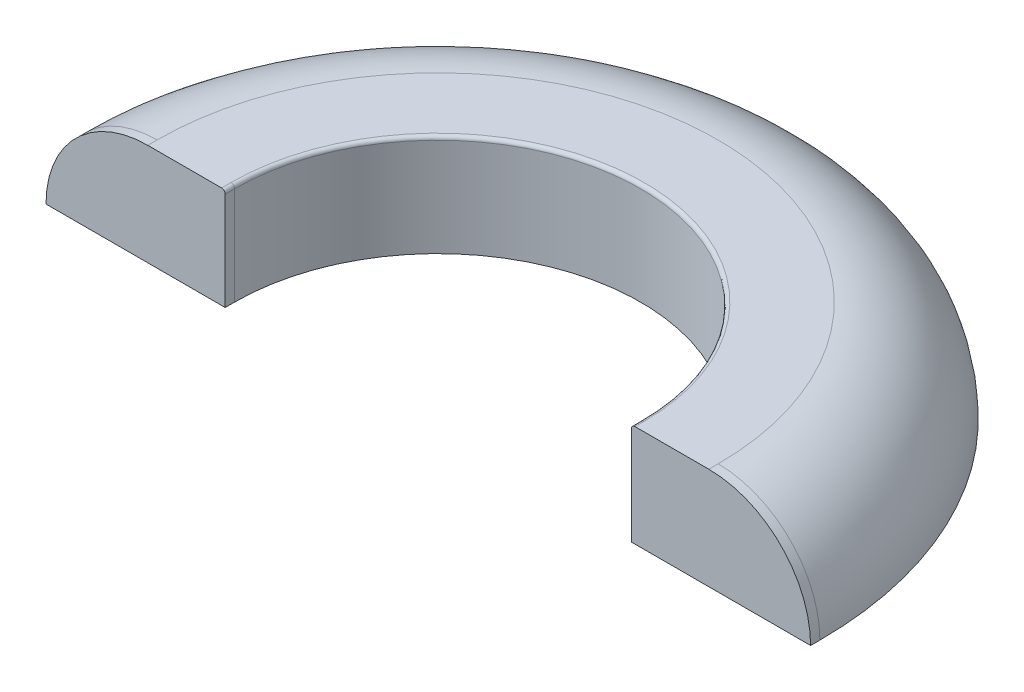
ISO-10303-21;
HEADER;
FILE_DESCRIPTION(('STEP AP214'),'2;1');
FILE_NAME('part.step','',(''),(''),'','','');
FILE_SCHEMA(('AUTOMOTIVE_DESIGN { 1 0 10303 214 1 1 1 1 }'));
ENDSEC;
DATA;
#1=APPLICATION_CONTEXT('core data for automotive mechanical design processes');
#2=APPLICATION_PROTOCOL_DEFINITION('international standard','automotive_design',2000,#1);
#3=PRODUCT_CONTEXT('',#1,'mechanical');
#4=PRODUCT('Part','Part','',(#3));
#5=PRODUCT_RELATED_PRODUCT_CATEGORY('part','',(#4));
#6=PRODUCT_DEFINITION_FORMATION('','',#4);
#7=PRODUCT_DEFINITION_CONTEXT('part definition',#1,'design');
#8=PRODUCT_DEFINITION('design','',#6,#7);
#9=PRODUCT_DEFINITION_SHAPE('','',#8);
#10=(LENGTH_UNIT() NAMED_UNIT(*) SI_UNIT(.MILLI.,.METRE.));
#11=(NAMED_UNIT(*) PLANE_ANGLE_UNIT() SI_UNIT($,.RADIAN.));
#12=(NAMED_UNIT(*) SI_UNIT($,.STERADIAN.) SOLID_ANGLE_UNIT());
#13=UNCERTAINTY_MEASURE_WITH_UNIT(LENGTH_MEASURE(1.E-05),#10,'distance_accuracy_value','');
#14=(GEOMETRIC_REPRESENTATION_CONTEXT(3) GLOBAL_UNCERTAINTY_ASSIGNED_CONTEXT((#13)) GLOBAL_UNIT_ASSIGNED_CONTEXT((#10,
#11,#12)) REPRESENTATION_CONTEXT('',''));
#15=CARTESIAN_POINT('',(0.,0.,0.));
#16=DIRECTION('',(0.,0.,1.));
#17=DIRECTION('',(1.,0.,0.));
#18=AXIS2_PLACEMENT_3D('',#15,#16,#17);
#19=CARTESIAN_POINT('',(0.,500.,0.));
#20=DIRECTION('',(0.,-1.,0.));
#21=DIRECTION('',(0.,0.,-1.));
#22=AXIS2_PLACEMENT_3D('',#19,#20,#21);
#23=CYLINDRICAL_SURFACE('',#22,566.6);
#24=CARTESIAN_POINT('',(0.,216.,0.));
#25=DIRECTION('',(0.,-1.,0.));
#26=DIRECTION('',(0.,0.,-1.));
#27=AXIS2_PLACEMENT_3D('',#24,#25,#26);
#28=CIRCLE('',#27,566.6);
#29=CARTESIAN_POINT('',(-566.6,216.,0.));
#30=VERTEX_POINT('',#29);
#31=CARTESIAN_POINT('',(566.6,216.,0.));
#32=VERTEX_POINT('',#31);
#33=EDGE_CURVE('E187',#30,#32,#28,.T.);
#34=ORIENTED_EDGE('',*,*,#33,.T.);
#35=DIRECTION('',(0.,-1.,0.));
#36=VECTOR('',#35,1.);
#37=CARTESIAN_POINT('',(566.6,500.,0.));
#38=LINE('',#37,#36);
#39=CARTESIAN_POINT('',(566.6,490.,0.));
#40=VERTEX_POINT('',#39);
#41=EDGE_CURVE('E205',#40,#32,#38,.T.);
#42=ORIENTED_EDGE('',*,*,#41,.F.);
#43=CARTESIAN_POINT('',(0.,490.,0.));
#44=DIRECTION('',(0.,-1.,0.));
#45=DIRECTION('',(0.,0.,-1.));
#46=AXIS2_PLACEMENT_3D('',#43,#44,#45);
#47=CIRCLE('',#46,566.6);
#48=CARTESIAN_POINT('',(-566.6,490.,0.));
#49=VERTEX_POINT('',#48);
#50=EDGE_CURVE('E11',#40,#49,#47,.F.);
#51=ORIENTED_EDGE('',*,*,#50,.T.);
#52=DIRECTION('',(0.,-1.,0.));
#53=VECTOR('',#52,1.);
#54=CARTESIAN_POINT('',(-566.6,500.,0.));
#55=LINE('',#54,#53);
#56=EDGE_CURVE('E201',#49,#30,#55,.T.);
#57=ORIENTED_EDGE('',*,*,#56,.T.);
#58=EDGE_LOOP('',(#34,#42,#51,#57));
#59=FACE_BOUND('',#58,.T.);
#60=ADVANCED_FACE('F41',(#59),#23,.F.);
#61=CARTESIAN_POINT('',(0.,500.,0.));
#62=DIRECTION('',(0.,-1.,0.));
#63=DIRECTION('',(0.,0.,-1.));
#64=AXIS2_PLACEMENT_3D('',#61,#62,#63);
#65=PLANE('',#64);
#66=CARTESIAN_POINT('',(0.,500.,0.));
#67=DIRECTION('',(0.,-1.,0.));
#68=DIRECTION('',(0.,0.,-1.));
#69=AXIS2_PLACEMENT_3D('',#66,#67,#68);
#70=CIRCLE('',#69,782.6);
#71=CARTESIAN_POINT('',(-782.6,500.,0.));
#72=VERTEX_POINT('',#71);
#73=CARTESIAN_POINT('',(782.6,500.,0.));
#74=VERTEX_POINT('',#73);
#75=EDGE_CURVE('E191',#72,#74,#70,.T.);
#76=ORIENTED_EDGE('',*,*,#75,.F.);
#77=DIRECTION('',(0.,0.,-1.));
#78=VECTOR('',#77,1.);
#79=CARTESIAN_POINT('',(-782.6,500.,26.));
#80=LINE('',#79,#78);
#81=CARTESIAN_POINT('',(-782.6,500.,26.));
#82=VERTEX_POINT('',#81);
#83=EDGE_CURVE('E57',#82,#72,#80,.T.);
#84=ORIENTED_EDGE('',*,*,#83,.F.);
#85=DIRECTION('',(-1.,0.,0.));
#86=VECTOR('',#85,1.);
#87=CARTESIAN_POINT('',(-782.6,500.,26.));
#88=LINE('',#87,#86);
#89=CARTESIAN_POINT('',(-576.6,500.,26.));
#90=VERTEX_POINT('',#89);
#91=EDGE_CURVE('E151',#90,#82,#88,.T.);
#92=ORIENTED_EDGE('',*,*,#91,.F.);
#93=DIRECTION('',(0.,0.,-1.));
#94=VECTOR('',#93,1.);
#95=CARTESIAN_POINT('',(-576.6,500.,26.));
#96=LINE('',#95,#94);
#97=CARTESIAN_POINT('',(-576.6,500.,0.));
#98=VERTEX_POINT('',#97);
#99=EDGE_CURVE('E180',#90,#98,#96,.T.);
#100=ORIENTED_EDGE('',*,*,#99,.T.);
#101=CARTESIAN_POINT('',(0.,500.,0.));
#102=DIRECTION('',(0.,-1.,0.));
#103=DIRECTION('',(0.,0.,-1.));
#104=AXIS2_PLACEMENT_3D('',#101,#102,#103);
#105=CIRCLE('',#104,576.6);
#106=CARTESIAN_POINT('',(576.6,500.,0.));
#107=VERTEX_POINT('',#106);
#108=EDGE_CURVE('E208',#98,#107,#105,.T.);
#109=ORIENTED_EDGE('',*,*,#108,.T.);
#110=DIRECTION('',(0.,0.,-1.));
#111=VECTOR('',#110,1.);
#112=CARTESIAN_POINT('',(576.6,500.,26.));
#113=LINE('',#112,#111);
#114=CARTESIAN_POINT('',(576.6,500.,26.));
#115=VERTEX_POINT('',#114);
#116=EDGE_CURVE('E228',#115,#107,#113,.T.);
#117=ORIENTED_EDGE('',*,*,#116,.F.);
#118=DIRECTION('',(-1.,0.,0.));
#119=VECTOR('',#118,1.);
#120=CARTESIAN_POINT('',(576.6,500.,26.));
#121=LINE('',#120,#119);
#122=CARTESIAN_POINT('',(782.6,500.,26.));
#123=VERTEX_POINT('',#122);
#124=EDGE_CURVE('E137',#123,#115,#121,.T.);
#125=ORIENTED_EDGE('',*,*,#124,.F.);
#126=DIRECTION('',(0.,0.,-1.));
#127=VECTOR('',#126,1.);
#128=CARTESIAN_POINT('',(782.6,500.,26.));
#129=LINE('',#128,#127);
#130=EDGE_CURVE('E250',#123,#74,#129,.T.);
#131=ORIENTED_EDGE('',*,*,#130,.T.);
#132=EDGE_LOOP('',(#76,#84,#92,#100,#109,#117,#125,#131));
#133=FACE_BOUND('',#132,.T.);
#134=ADVANCED_FACE('F227',(#133),#65,.F.);
#135=CARTESIAN_POINT('',(0.,490.,0.));
#136=DIRECTION('',(0.,-1.,0.));
#137=DIRECTION('',(0.,0.,-1.));
#138=AXIS2_PLACEMENT_3D('',#135,#136,#137);
#139=TOROIDAL_SURFACE('',#138,576.6,10.);
#140=CARTESIAN_POINT('',(-576.6,490.,0.));
#141=DIRECTION('',(0.,0.,-1.));
#142=DIRECTION('',(-1.,0.,0.));
#143=AXIS2_PLACEMENT_3D('',#140,#141,#142);
#144=CIRCLE('',#143,10.);
#145=EDGE_CURVE('E212',#49,#98,#144,.F.);
#146=ORIENTED_EDGE('',*,*,#145,.F.);
#147=ORIENTED_EDGE('',*,*,#50,.F.);
#148=CARTESIAN_POINT('',(576.6,490.,0.));
#149=DIRECTION('',(0.,0.,-1.));
#150=DIRECTION('',(-1.,0.,0.));
#151=AXIS2_PLACEMENT_3D('',#148,#149,#150);
#152=CIRCLE('',#151,10.);
#153=EDGE_CURVE('E50',#107,#40,#152,.F.);
#154=ORIENTED_EDGE('',*,*,#153,.F.);
#155=ORIENTED_EDGE('',*,*,#108,.F.);
#156=EDGE_LOOP('',(#146,#147,#154,#155));
#157=FACE_BOUND('',#156,.T.);
#158=ADVANCED_FACE('F43',(#157),#139,.T.);
#159=CARTESIAN_POINT('',(-1066.6,216.,0.));
#160=DIRECTION('',(0.,-1.,0.));
#161=DIRECTION('',(0.,0.,-1.));
#162=AXIS2_PLACEMENT_3D('',#159,#160,#161);
#163=PLANE('',#162);
#164=CARTESIAN_POINT('',(0.,216.,0.));
#165=DIRECTION('',(0.,-1.,0.));
#166=DIRECTION('',(0.,0.,-1.));
#167=AXIS2_PLACEMENT_3D('',#164,#165,#166);
#168=CIRCLE('',#167,1066.6);
#169=CARTESIAN_POINT('',(-1066.6,216.,0.));
#170=VERTEX_POINT('',#169);
#171=CARTESIAN_POINT('',(1066.6,216.,0.));
#172=VERTEX_POINT('',#171);
#173=EDGE_CURVE('E183',#170,#172,#168,.T.);
#174=ORIENTED_EDGE('',*,*,#173,.T.);
#175=DIRECTION('',(0.,0.,-1.));
#176=VECTOR('',#175,1.);
#177=CARTESIAN_POINT('',(1066.6,216.,26.));
#178=LINE('',#177,#176);
#179=CARTESIAN_POINT('',(1066.6,216.,26.));
#180=VERTEX_POINT('',#179);
#181=EDGE_CURVE('E65',#180,#172,#178,.T.);
#182=ORIENTED_EDGE('',*,*,#181,.F.);
#183=DIRECTION('',(1.,0.,0.));
#184=VECTOR('',#183,1.);
#185=CARTESIAN_POINT('',(1066.6,216.,26.));
#186=LINE('',#185,#184);
#187=CARTESIAN_POINT('',(566.6,216.,26.));
#188=VERTEX_POINT('',#187);
#189=EDGE_CURVE('E131',#188,#180,#186,.T.);
#190=ORIENTED_EDGE('',*,*,#189,.F.);
#191=DIRECTION('',(0.,0.,-1.));
#192=VECTOR('',#191,1.);
#193=CARTESIAN_POINT('',(566.6,216.,26.));
#194=LINE('',#193,#192);
#195=EDGE_CURVE('E127',#188,#32,#194,.T.);
#196=ORIENTED_EDGE('',*,*,#195,.T.);
#197=ORIENTED_EDGE('',*,*,#33,.F.);
#198=DIRECTION('',(0.,0.,-1.));
#199=VECTOR('',#198,1.);
#200=CARTESIAN_POINT('',(-566.6,216.,26.));
#201=LINE('',#200,#199);
#202=CARTESIAN_POINT('',(-566.6,216.,26.));
#203=VERTEX_POINT('',#202);
#204=EDGE_CURVE('E171',#203,#30,#201,.T.);
#205=ORIENTED_EDGE('',*,*,#204,.F.);
#206=DIRECTION('',(1.,0.,0.));
#207=VECTOR('',#206,1.);
#208=CARTESIAN_POINT('',(-566.6,216.,26.));
#209=LINE('',#208,#207);
#210=CARTESIAN_POINT('',(-1066.6,216.,26.));
#211=VERTEX_POINT('',#210);
#212=EDGE_CURVE('E161',#211,#203,#209,.T.);
#213=ORIENTED_EDGE('',*,*,#212,.F.);
#214=DIRECTION('',(0.,0.,-1.));
#215=VECTOR('',#214,1.);
#216=CARTESIAN_POINT('',(-1066.6,216.,26.));
#217=LINE('',#216,#215);
#218=EDGE_CURVE('E174',#211,#170,#217,.T.);
#219=ORIENTED_EDGE('',*,*,#218,.T.);
#220=EDGE_LOOP('',(#174,#182,#190,#196,#197,#205,#213,#219));
#221=FACE_BOUND('',#220,.T.);
#222=ADVANCED_FACE('F239',(#221),#163,.T.);
#223=CARTESIAN_POINT('',(0.,216.,0.));
#224=DIRECTION('',(0.,-1.,0.));
#225=DIRECTION('',(0.,0.,-1.));
#226=AXIS2_PLACEMENT_3D('',#223,#224,#225);
#227=TOROIDAL_SURFACE('',#226,782.6,284.);
#228=CARTESIAN_POINT('',(782.6,216.,0.));
#229=DIRECTION('',(0.,0.,-1.));
#230=DIRECTION('',(-1.,0.,0.));
#231=AXIS2_PLACEMENT_3D('',#228,#229,#230);
#232=CIRCLE('',#231,284.);
#233=EDGE_CURVE('E198',#74,#172,#232,.T.);
#234=ORIENTED_EDGE('',*,*,#233,.T.);
#235=ORIENTED_EDGE('',*,*,#173,.F.);
#236=CARTESIAN_POINT('',(-782.6,216.,0.));
#237=DIRECTION('',(0.,0.,-1.));
#238=DIRECTION('',(-1.,0.,0.));
#239=AXIS2_PLACEMENT_3D('',#236,#237,#238);
#240=CIRCLE('',#239,284.);
#241=EDGE_CURVE('E195',#170,#72,#240,.T.);
#242=ORIENTED_EDGE('',*,*,#241,.T.);
#243=ORIENTED_EDGE('',*,*,#75,.T.);
#244=EDGE_LOOP('',(#234,#235,#242,#243));
#245=FACE_BOUND('',#244,.T.);
#246=ADVANCED_FACE('F256',(#245),#227,.T.);
#247=CARTESIAN_POINT('',(-576.6,490.,26.));
#248=DIRECTION('',(0.,0.,-1.));
#249=DIRECTION('',(-1.,0.,0.));
#250=AXIS2_PLACEMENT_3D('',#247,#248,#249);
#251=CYLINDRICAL_SURFACE('',#250,10.);
#252=ORIENTED_EDGE('',*,*,#145,.T.);
#253=ORIENTED_EDGE('',*,*,#99,.F.);
#254=CARTESIAN_POINT('',(-576.6,490.,26.));
#255=DIRECTION('',(0.,0.,1.));
#256=DIRECTION('',(1.,0.,0.));
#257=AXIS2_PLACEMENT_3D('',#254,#255,#256);
#258=CIRCLE('',#257,10.);
#259=CARTESIAN_POINT('',(-566.6,490.,26.));
#260=VERTEX_POINT('',#259);
#261=EDGE_CURVE('E146',#260,#90,#258,.T.);
#262=ORIENTED_EDGE('',*,*,#261,.F.);
#263=DIRECTION('',(0.,0.,-1.));
#264=VECTOR('',#263,1.);
#265=CARTESIAN_POINT('',(-566.6,490.,26.));
#266=LINE('',#265,#264);
#267=EDGE_CURVE('E167',#260,#49,#266,.T.);
#268=ORIENTED_EDGE('',*,*,#267,.T.);
#269=EDGE_LOOP('',(#252,#253,#262,#268));
#270=FACE_BOUND('',#269,.T.);
#271=ADVANCED_FACE('F220',(#270),#251,.T.);
#272=CARTESIAN_POINT('',(-782.6,216.,26.));
#273=DIRECTION('',(0.,0.,-1.));
#274=DIRECTION('',(-1.,0.,0.));
#275=AXIS2_PLACEMENT_3D('',#272,#273,#274);
#276=CYLINDRICAL_SURFACE('',#275,284.);
#277=ORIENTED_EDGE('',*,*,#241,.F.);
#278=ORIENTED_EDGE('',*,*,#218,.F.);
#279=CARTESIAN_POINT('',(-782.6,216.,26.));
#280=DIRECTION('',(0.,0.,1.));
#281=DIRECTION('',(1.,0.,0.));
#282=AXIS2_PLACEMENT_3D('',#279,#280,#281);
#283=CIRCLE('',#282,284.);
#284=EDGE_CURVE('E158',#82,#211,#283,.T.);
#285=ORIENTED_EDGE('',*,*,#284,.F.);
#286=ORIENTED_EDGE('',*,*,#83,.T.);
#287=EDGE_LOOP('',(#277,#278,#285,#286));
#288=FACE_BOUND('',#287,.T.);
#289=ADVANCED_FACE('F259',(#288),#276,.T.);
#290=CARTESIAN_POINT('',(-566.6,490.,26.));
#291=DIRECTION('',(-1.,0.,0.));
#292=DIRECTION('',(0.,0.,1.));
#293=AXIS2_PLACEMENT_3D('',#290,#291,#292);
#294=PLANE('',#293);
#295=ORIENTED_EDGE('',*,*,#56,.F.);
#296=ORIENTED_EDGE('',*,*,#267,.F.);
#297=DIRECTION('',(0.,1.,0.));
#298=VECTOR('',#297,1.);
#299=CARTESIAN_POINT('',(-566.6,490.,26.));
#300=LINE('',#299,#298);
#301=EDGE_CURVE('E164',#203,#260,#300,.T.);
#302=ORIENTED_EDGE('',*,*,#301,.F.);
#303=ORIENTED_EDGE('',*,*,#204,.T.);
#304=EDGE_LOOP('',(#295,#296,#302,#303));
#305=FACE_BOUND('',#304,.T.);
#306=ADVANCED_FACE('F235',(#305),#294,.F.);
#307=CARTESIAN_POINT('',(-576.6,490.,26.));
#308=DIRECTION('',(0.,0.,1.));
#309=DIRECTION('',(1.,0.,0.));
#310=AXIS2_PLACEMENT_3D('',#307,#308,#309);
#311=PLANE('',#310);
#312=ORIENTED_EDGE('',*,*,#261,.T.);
#313=ORIENTED_EDGE('',*,*,#91,.T.);
#314=ORIENTED_EDGE('',*,*,#284,.T.);
#315=ORIENTED_EDGE('',*,*,#212,.T.);
#316=ORIENTED_EDGE('',*,*,#301,.T.);
#317=EDGE_LOOP('',(#312,#313,#314,#315,#316));
#318=FACE_BOUND('',#317,.T.);
#319=ADVANCED_FACE('F230',(#318),#311,.T.);
#320=CARTESIAN_POINT('',(576.6,490.,26.));
#321=DIRECTION('',(0.,0.,-1.));
#322=DIRECTION('',(-1.,0.,0.));
#323=AXIS2_PLACEMENT_3D('',#320,#321,#322);
#324=CYLINDRICAL_SURFACE('',#323,10.);
#325=ORIENTED_EDGE('',*,*,#153,.T.);
#326=DIRECTION('',(0.,0.,-1.));
#327=VECTOR('',#326,1.);
#328=CARTESIAN_POINT('',(566.6,490.,26.));
#329=LINE('',#328,#327);
#330=CARTESIAN_POINT('',(566.6,490.,26.));
#331=VERTEX_POINT('',#330);
#332=EDGE_CURVE('E124',#331,#40,#329,.T.);
#333=ORIENTED_EDGE('',*,*,#332,.F.);
#334=CARTESIAN_POINT('',(576.6,490.,26.));
#335=DIRECTION('',(0.,0.,1.));
#336=DIRECTION('',(1.,0.,0.));
#337=AXIS2_PLACEMENT_3D('',#334,#335,#336);
#338=CIRCLE('',#337,10.);
#339=EDGE_CURVE('E132',#115,#331,#338,.T.);
#340=ORIENTED_EDGE('',*,*,#339,.F.);
#341=ORIENTED_EDGE('',*,*,#116,.T.);
#342=EDGE_LOOP('',(#325,#333,#340,#341));
#343=FACE_BOUND('',#342,.T.);
#344=ADVANCED_FACE('F142',(#343),#324,.T.);
#345=CARTESIAN_POINT('',(566.6,490.,26.));
#346=DIRECTION('',(1.,0.,0.));
#347=DIRECTION('',(0.,0.,-1.));
#348=AXIS2_PLACEMENT_3D('',#345,#346,#347);
#349=PLANE('',#348);
#350=ORIENTED_EDGE('',*,*,#41,.T.);
#351=ORIENTED_EDGE('',*,*,#195,.F.);
#352=DIRECTION('',(0.,-1.,0.));
#353=VECTOR('',#352,1.);
#354=CARTESIAN_POINT('',(566.6,490.,26.));
#355=LINE('',#354,#353);
#356=EDGE_CURVE('E120',#331,#188,#355,.T.);
#357=ORIENTED_EDGE('',*,*,#356,.F.);
#358=ORIENTED_EDGE('',*,*,#332,.T.);
#359=EDGE_LOOP('',(#350,#351,#357,#358));
#360=FACE_BOUND('',#359,.T.);
#361=ADVANCED_FACE('F122',(#360),#349,.F.);
#362=CARTESIAN_POINT('',(782.6,216.,26.));
#363=DIRECTION('',(0.,0.,-1.));
#364=DIRECTION('',(-1.,0.,0.));
#365=AXIS2_PLACEMENT_3D('',#362,#363,#364);
#366=CYLINDRICAL_SURFACE('',#365,284.);
#367=ORIENTED_EDGE('',*,*,#233,.F.);
#368=ORIENTED_EDGE('',*,*,#130,.F.);
#369=CARTESIAN_POINT('',(782.6,216.,26.));
#370=DIRECTION('',(0.,0.,1.));
#371=DIRECTION('',(1.,0.,0.));
#372=AXIS2_PLACEMENT_3D('',#369,#370,#371);
#373=CIRCLE('',#372,284.);
#374=EDGE_CURVE('E241',#180,#123,#373,.T.);
#375=ORIENTED_EDGE('',*,*,#374,.F.);
#376=ORIENTED_EDGE('',*,*,#181,.T.);
#377=EDGE_LOOP('',(#367,#368,#375,#376));
#378=FACE_BOUND('',#377,.T.);
#379=ADVANCED_FACE('F333',(#378),#366,.T.);
#380=CARTESIAN_POINT('',(576.6,490.,26.));
#381=DIRECTION('',(0.,0.,1.));
#382=DIRECTION('',(1.,0.,0.));
#383=AXIS2_PLACEMENT_3D('',#380,#381,#382);
#384=PLANE('',#383);
#385=ORIENTED_EDGE('',*,*,#339,.T.);
#386=ORIENTED_EDGE('',*,*,#356,.T.);
#387=ORIENTED_EDGE('',*,*,#189,.T.);
#388=ORIENTED_EDGE('',*,*,#374,.T.);
#389=ORIENTED_EDGE('',*,*,#124,.T.);
#390=EDGE_LOOP('',(#385,#386,#387,#388,#389));
#391=FACE_BOUND('',#390,.T.);
#392=ADVANCED_FACE('F135',(#391),#384,.T.);
#393=CLOSED_SHELL('',(#60,#134,#158,#222,#246,#271,#289,#306,#319,#344,#361,#379,#392));
#394=MANIFOLD_SOLID_BREP('B2',#393);
#395=ADVANCED_BREP_SHAPE_REPRESENTATION('',(#18,#394),#14);
#396=SHAPE_DEFINITION_REPRESENTATION(#9,#395);
ENDSEC;
END-ISO-10303-21;
